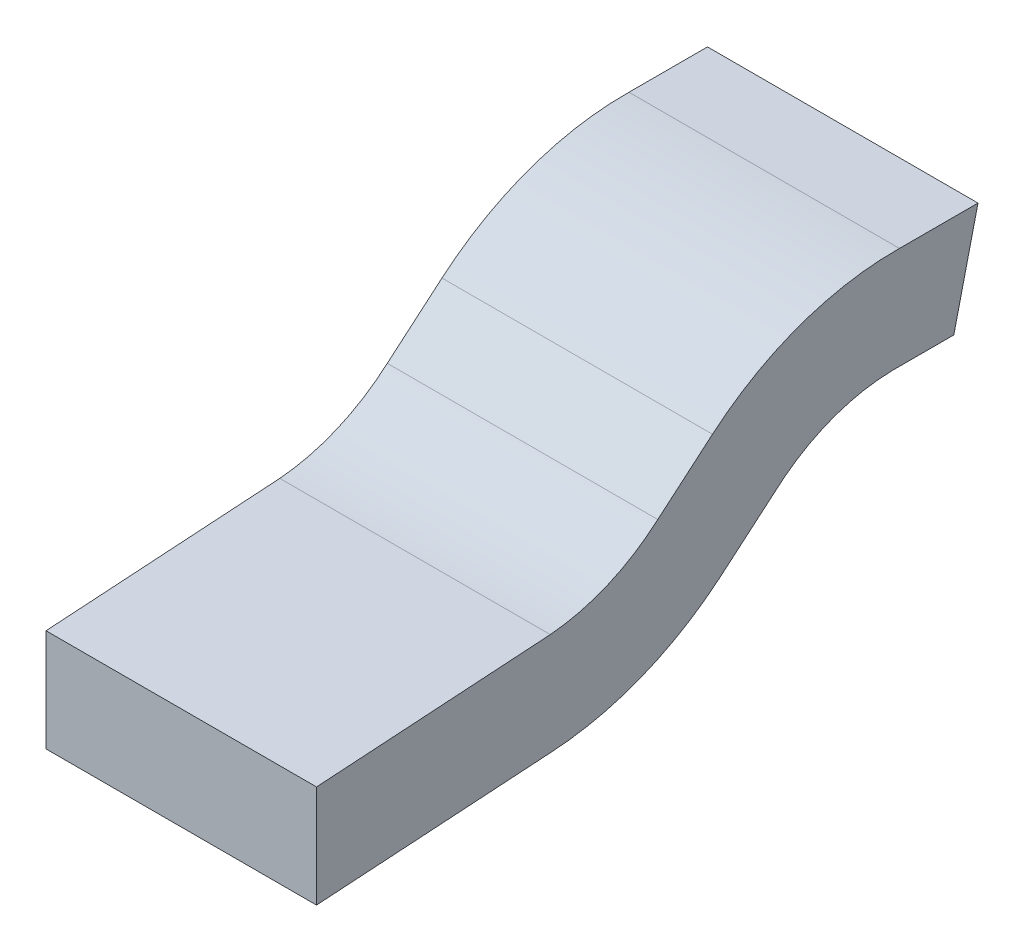
ISO-10303-21;
HEADER;
FILE_DESCRIPTION(('STEP AP214'),'2;1');
FILE_NAME('part.step','',(''),(''),'','','');
FILE_SCHEMA(('AUTOMOTIVE_DESIGN { 1 0 10303 214 1 1 1 1 }'));
ENDSEC;
DATA;
#1=APPLICATION_CONTEXT('core data for automotive mechanical design processes');
#2=APPLICATION_PROTOCOL_DEFINITION('international standard','automotive_design',2000,#1);
#3=PRODUCT_CONTEXT('',#1,'mechanical');
#4=PRODUCT('Part','Part','',(#3));
#5=PRODUCT_RELATED_PRODUCT_CATEGORY('part','',(#4));
#6=PRODUCT_DEFINITION_FORMATION('','',#4);
#7=PRODUCT_DEFINITION_CONTEXT('part definition',#1,'design');
#8=PRODUCT_DEFINITION('design','',#6,#7);
#9=PRODUCT_DEFINITION_SHAPE('','',#8);
#10=(LENGTH_UNIT() NAMED_UNIT(*) SI_UNIT(.MILLI.,.METRE.));
#11=(NAMED_UNIT(*) PLANE_ANGLE_UNIT() SI_UNIT($,.RADIAN.));
#12=(NAMED_UNIT(*) SI_UNIT($,.STERADIAN.) SOLID_ANGLE_UNIT());
#13=UNCERTAINTY_MEASURE_WITH_UNIT(LENGTH_MEASURE(1.E-05),#10,'distance_accuracy_value','');
#14=(GEOMETRIC_REPRESENTATION_CONTEXT(3) GLOBAL_UNCERTAINTY_ASSIGNED_CONTEXT((#13)) GLOBAL_UNIT_ASSIGNED_CONTEXT((#10,
#11,#12)) REPRESENTATION_CONTEXT('',''));
#15=CARTESIAN_POINT('',(0.,0.,0.));
#16=DIRECTION('',(0.,0.,1.));
#17=DIRECTION('',(1.,0.,0.));
#18=AXIS2_PLACEMENT_3D('',#15,#16,#17);
#19=CARTESIAN_POINT('',(1.93,-0.21911513416,1.58959157295));
#20=DIRECTION('',(-1.,0.,0.));
#21=DIRECTION('',(0.,1.,0.));
#22=AXIS2_PLACEMENT_3D('',#19,#20,#21);
#23=PLANE('',#22);
#24=CARTESIAN_POINT('',(1.93,-0.856134104349004,1.903958845955));
#25=DIRECTION('',(1.,0.,0.));
#26=DIRECTION('',(0.,0.936329177569152,0.351123441588105));
#27=AXIS2_PLACEMENT_3D('',#24,#25,#26);
#28=CIRCLE('',#27,0.776782196841003);
#29=CARTESIAN_POINT('',(1.93,-0.07940390005396,1.894971573585));
#30=VERTEX_POINT('',#29);
#31=CARTESIAN_POINT('',(1.93,-0.263875831851088,2.40649088251571));
#32=VERTEX_POINT('',#31);
#33=EDGE_CURVE('E317',#30,#32,#28,.T.);
#34=ORIENTED_EDGE('',*,*,#33,.F.);
#35=DIRECTION('',(0.,0.,1.));
#36=VECTOR('',#35,1.);
#37=CARTESIAN_POINT('',(1.93,-0.07940390005396,1.580604300581));
#38=LINE('',#37,#36);
#39=CARTESIAN_POINT('',(1.93,-0.07940390005397,1.680137635818));
#40=VERTEX_POINT('',#39);
#41=EDGE_CURVE('E29',#40,#30,#38,.T.);
#42=ORIENTED_EDGE('',*,*,#41,.F.);
#43=DIRECTION('',(0.,-0.973080287490057,0.230466383879013));
#44=VECTOR('',#43,1.);
#45=CARTESIAN_POINT('',(1.93,-0.630185003499,1.810585791897));
#46=LINE('',#45,#44);
#47=CARTESIAN_POINT('',(1.93,-0.358826368266,1.746316641447));
#48=VERTEX_POINT('',#47);
#49=EDGE_CURVE('E11',#40,#48,#46,.T.);
#50=ORIENTED_EDGE('',*,*,#49,.T.);
#51=DIRECTION('',(0.,0.,-1.));
#52=VECTOR('',#51,1.);
#53=CARTESIAN_POINT('',(1.93,-0.358826368266,1.59857884532));
#54=LINE('',#53,#52);
#55=CARTESIAN_POINT('',(1.93,-0.358826368266,1.912946118324));
#56=VERTEX_POINT('',#55);
#57=EDGE_CURVE('E353',#56,#48,#54,.T.);
#58=ORIENTED_EDGE('',*,*,#57,.F.);
#59=CARTESIAN_POINT('',(1.93,-0.856134104348996,1.903958845955));
#60=DIRECTION('',(1.,0.,0.));
#61=DIRECTION('',(0.,0.738961988180257,0.67374711875056));
#62=AXIS2_PLACEMENT_3D('',#59,#60,#61);
#63=CIRCLE('',#62,0.497388937787997);
#64=CARTESIAN_POINT('',(1.93,-0.488521483012,2.2391289202));
#65=VERTEX_POINT('',#64);
#66=EDGE_CURVE('E152',#56,#65,#63,.T.);
#67=ORIENTED_EDGE('',*,*,#66,.T.);
#68=DIRECTION('',(0.,0.647648420096034,-0.76193931775904));
#69=VECTOR('',#68,1.);
#70=CARTESIAN_POINT('',(1.93,-0.48846038004,2.239184630712));
#71=LINE('',#70,#69);
#72=CARTESIAN_POINT('',(1.93,-0.615614851585,2.388778126647));
#73=VERTEX_POINT('',#72);
#74=EDGE_CURVE('E146',#73,#65,#71,.T.);
#75=ORIENTED_EDGE('',*,*,#74,.F.);
#76=CARTESIAN_POINT('',(1.93,-0.00794982250667015,2.893498141348));
#77=DIRECTION('',(1.,0.,0.));
#78=DIRECTION('',(0.,-0.926566511782986,-0.376130960228364));
#79=AXIS2_PLACEMENT_3D('',#76,#77,#78);
#80=CIRCLE('',#79,0.789936124509003);
#81=CARTESIAN_POINT('',(1.93,-0.796685529020846,2.85013723881213));
#82=VERTEX_POINT('',#81);
#83=EDGE_CURVE('E336',#82,#73,#80,.T.);
#84=ORIENTED_EDGE('',*,*,#83,.F.);
#85=DIRECTION('',(0.,0.0641948026383885,-0.997937386469822));
#86=VECTOR('',#85,1.);
#87=CARTESIAN_POINT('',(1.93,-0.796676109769,2.850137707743));
#88=LINE('',#87,#86);
#89=CARTESIAN_POINT('',(1.93,-0.837814321152,3.489649902865));
#90=VERTEX_POINT('',#89);
#91=EDGE_CURVE('E367',#90,#82,#88,.T.);
#92=ORIENTED_EDGE('',*,*,#91,.F.);
#93=DIRECTION('',(0.,-1.,0.));
#94=VECTOR('',#93,1.);
#95=CARTESIAN_POINT('',(1.93,-0.697814321152,3.489649902865));
#96=LINE('',#95,#94);
#97=CARTESIAN_POINT('',(1.93,-0.557814321152,3.489649902865));
#98=VERTEX_POINT('',#97);
#99=EDGE_CURVE('E374',#98,#90,#96,.T.);
#100=ORIENTED_EDGE('',*,*,#99,.F.);
#101=DIRECTION('',(0.,-0.0641948026383885,0.997937386469822));
#102=VECTOR('',#101,1.);
#103=CARTESIAN_POINT('',(1.93,-0.516676109769,2.850137707743));
#104=LINE('',#103,#102);
#105=CARTESIAN_POINT('',(1.93,-0.516661571834,2.85013894686));
#106=VERTEX_POINT('',#105);
#107=EDGE_CURVE('E243',#106,#98,#104,.T.);
#108=ORIENTED_EDGE('',*,*,#107,.F.);
#109=CARTESIAN_POINT('',(1.93,-0.00794982250666897,2.89349814134801));
#110=DIRECTION('',(1.,0.,0.));
#111=DIRECTION('',(0.,-0.750420434887286,-0.660960793771898));
#112=AXIS2_PLACEMENT_3D('',#109,#110,#111);
#113=CIRCLE('',#112,0.510541639019009);
#114=CARTESIAN_POINT('',(1.93,-0.391070701287,2.556050134368));
#115=VERTEX_POINT('',#114);
#116=EDGE_CURVE('E246',#106,#115,#113,.T.);
#117=ORIENTED_EDGE('',*,*,#116,.T.);
#118=DIRECTION('',(0.,-0.647648420096034,0.76193931775904));
#119=VECTOR('',#118,1.);
#120=CARTESIAN_POINT('',(1.93,-0.263916229743,2.406456638433));
#121=LINE('',#120,#119);
#122=EDGE_CURVE('E318',#32,#115,#121,.T.);
#123=ORIENTED_EDGE('',*,*,#122,.F.);
#124=EDGE_LOOP('',(#34,#42,#50,#58,#67,#75,#84,#92,#100,#108,#117,#123));
#125=FACE_BOUND('',#124,.T.);
#126=ADVANCED_FACE('F17',(#125),#23,.T.);
#127=CARTESIAN_POINT('',(2.3,-0.630185003499,1.810585791897));
#128=DIRECTION('',(0.,0.230466383879013,0.973080287490057));
#129=DIRECTION('',(1.,4.09093995219019E-13,0.));
#130=AXIS2_PLACEMENT_3D('',#127,#128,#129);
#131=PLANE('',#130);
#132=DIRECTION('',(-1.,0.,0.));
#133=VECTOR('',#132,1.);
#134=CARTESIAN_POINT('',(2.3,-0.07940390005396,1.680137635818));
#135=LINE('',#134,#133);
#136=CARTESIAN_POINT('',(2.67,-0.07940390005396,1.680137635818));
#137=VERTEX_POINT('',#136);
#138=EDGE_CURVE('E340',#137,#40,#135,.T.);
#139=ORIENTED_EDGE('',*,*,#138,.F.);
#140=DIRECTION('',(0.,0.973080287490057,-0.230466383879013));
#141=VECTOR('',#140,1.);
#142=CARTESIAN_POINT('',(2.67,-0.358826368266,1.746316641447));
#143=LINE('',#142,#141);
#144=CARTESIAN_POINT('',(2.67,-0.358826368266,1.746316641447));
#145=VERTEX_POINT('',#144);
#146=EDGE_CURVE('E176',#145,#137,#143,.T.);
#147=ORIENTED_EDGE('',*,*,#146,.F.);
#148=DIRECTION('',(1.,0.,0.));
#149=VECTOR('',#148,1.);
#150=CARTESIAN_POINT('',(2.3,-0.358826368266,1.746316641447));
#151=LINE('',#150,#149);
#152=EDGE_CURVE('E186',#48,#145,#151,.T.);
#153=ORIENTED_EDGE('',*,*,#152,.F.);
#154=ORIENTED_EDGE('',*,*,#49,.F.);
#155=EDGE_LOOP('',(#139,#147,#153,#154));
#156=FACE_BOUND('',#155,.T.);
#157=ADVANCED_FACE('F19',(#156),#131,.F.);
#158=CARTESIAN_POINT('',(2.3,-0.07940390005396,1.580604300581));
#159=DIRECTION('',(0.,1.,0.));
#160=DIRECTION('',(1.,0.,0.));
#161=AXIS2_PLACEMENT_3D('',#158,#159,#160);
#162=PLANE('',#161);
#163=DIRECTION('',(-1.,0.,0.));
#164=VECTOR('',#163,1.);
#165=CARTESIAN_POINT('',(2.3,-0.07940390005396,1.894971573585));
#166=LINE('',#165,#164);
#167=CARTESIAN_POINT('',(2.67,-0.07940390005396,1.894971573585));
#168=VERTEX_POINT('',#167);
#169=EDGE_CURVE('E311',#168,#30,#166,.T.);
#170=ORIENTED_EDGE('',*,*,#169,.F.);
#171=DIRECTION('',(0.,0.,1.));
#172=VECTOR('',#171,1.);
#173=CARTESIAN_POINT('',(2.67,-0.07940390005396,1.58959157295));
#174=LINE('',#173,#172);
#175=EDGE_CURVE('E314',#137,#168,#174,.T.);
#176=ORIENTED_EDGE('',*,*,#175,.F.);
#177=ORIENTED_EDGE('',*,*,#138,.T.);
#178=ORIENTED_EDGE('',*,*,#41,.T.);
#179=EDGE_LOOP('',(#170,#176,#177,#178));
#180=FACE_BOUND('',#179,.T.);
#181=ADVANCED_FACE('F267',(#180),#162,.T.);
#182=CARTESIAN_POINT('',(2.3,-0.856134104349,1.903958845955));
#183=DIRECTION('',(-1.,0.,0.));
#184=DIRECTION('',(0.,0.,1.));
#185=AXIS2_PLACEMENT_3D('',#182,#183,#184);
#186=CYLINDRICAL_SURFACE('',#185,0.776782196841);
#187=CARTESIAN_POINT('',(2.67,-0.263916199883721,2.40645660330444));
#188=DIRECTION('',(-1.,0.,0.));
#189=VECTOR('',#188,1.);
#190=LINE('',#187,#189);
#191=CARTESIAN_POINT('',(2.67,-0.263875831851088,2.40649088251571));
#192=VERTEX_POINT('',#191);
#193=EDGE_CURVE('E323',#192,#32,#190,.T.);
#194=ORIENTED_EDGE('',*,*,#193,.F.);
#195=CARTESIAN_POINT('',(2.67,-0.856134104349,1.903958845955));
#196=DIRECTION('',(1.,0.,0.));
#197=DIRECTION('',(0.,0.,1.));
#198=AXIS2_PLACEMENT_3D('',#195,#196,#197);
#199=CIRCLE('',#198,0.776782196841);
#200=EDGE_CURVE('E321',#168,#192,#199,.T.);
#201=ORIENTED_EDGE('',*,*,#200,.F.);
#202=ORIENTED_EDGE('',*,*,#169,.T.);
#203=ORIENTED_EDGE('',*,*,#33,.T.);
#204=EDGE_LOOP('',(#194,#201,#202,#203));
#205=FACE_BOUND('',#204,.T.);
#206=ADVANCED_FACE('F258',(#205),#186,.T.);
#207=CARTESIAN_POINT('',(2.3,-0.263916229743,2.406456638433));
#208=DIRECTION('',(0.,0.76193931775904,0.647648420096034));
#209=DIRECTION('',(1.,0.,0.));
#210=AXIS2_PLACEMENT_3D('',#207,#208,#209);
#211=PLANE('',#210);
#212=ORIENTED_EDGE('',*,*,#193,.T.);
#213=ORIENTED_EDGE('',*,*,#122,.T.);
#214=DIRECTION('',(1.,0.,0.));
#215=VECTOR('',#214,1.);
#216=CARTESIAN_POINT('',(2.3,-0.391070701287,2.556050134368));
#217=LINE('',#216,#215);
#218=CARTESIAN_POINT('',(2.67,-0.391070701287,2.556050134368));
#219=VERTEX_POINT('',#218);
#220=EDGE_CURVE('E252',#115,#219,#217,.T.);
#221=ORIENTED_EDGE('',*,*,#220,.T.);
#222=DIRECTION('',(0.,-0.647648420096034,0.76193931775904));
#223=VECTOR('',#222,1.);
#224=CARTESIAN_POINT('',(2.67,-0.263916229743,2.406456638433));
#225=LINE('',#224,#223);
#226=EDGE_CURVE('E234',#192,#219,#225,.T.);
#227=ORIENTED_EDGE('',*,*,#226,.F.);
#228=EDGE_LOOP('',(#212,#213,#221,#227));
#229=FACE_BOUND('',#228,.T.);
#230=ADVANCED_FACE('F206',(#229),#211,.T.);
#231=CARTESIAN_POINT('',(2.3,-0.007949822506674,2.893498141348));
#232=DIRECTION('',(1.,0.,0.));
#233=DIRECTION('',(0.,0.,-1.));
#234=AXIS2_PLACEMENT_3D('',#231,#232,#233);
#235=CYLINDRICAL_SURFACE('',#234,0.510541639019);
#236=ORIENTED_EDGE('',*,*,#116,.F.);
#237=CARTESIAN_POINT('',(2.67,-0.516676129239368,2.85013801041872));
#238=DIRECTION('',(-1.,0.,0.));
#239=VECTOR('',#238,1.);
#240=LINE('',#237,#239);
#241=CARTESIAN_POINT('',(2.67,-0.516661720904141,2.85014096168472));
#242=VERTEX_POINT('',#241);
#243=EDGE_CURVE('E226',#242,#106,#240,.T.);
#244=ORIENTED_EDGE('',*,*,#243,.F.);
#245=CARTESIAN_POINT('',(2.67,-0.007949822506674,2.893498141348));
#246=DIRECTION('',(-1.,0.,0.));
#247=DIRECTION('',(0.,0.,-1.));
#248=AXIS2_PLACEMENT_3D('',#245,#246,#247);
#249=CIRCLE('',#248,0.510541639019);
#250=EDGE_CURVE('E229',#219,#242,#249,.T.);
#251=ORIENTED_EDGE('',*,*,#250,.F.);
#252=ORIENTED_EDGE('',*,*,#220,.F.);
#253=EDGE_LOOP('',(#236,#244,#251,#252));
#254=FACE_BOUND('',#253,.T.);
#255=ADVANCED_FACE('F196',(#254),#235,.F.);
#256=CARTESIAN_POINT('',(2.3,-0.516676109769,2.850137707743));
#257=DIRECTION('',(0.,0.997937386469822,0.0641948026383885));
#258=DIRECTION('',(1.,0.,0.));
#259=AXIS2_PLACEMENT_3D('',#256,#257,#258);
#260=PLANE('',#259);
#261=ORIENTED_EDGE('',*,*,#243,.T.);
#262=ORIENTED_EDGE('',*,*,#107,.T.);
#263=DIRECTION('',(-1.,0.,0.));
#264=VECTOR('',#263,1.);
#265=CARTESIAN_POINT('',(2.3,-0.557814321152,3.489649902865));
#266=LINE('',#265,#264);
#267=CARTESIAN_POINT('',(2.67,-0.557814321152,3.489649902865));
#268=VERTEX_POINT('',#267);
#269=EDGE_CURVE('E370',#268,#98,#266,.T.);
#270=ORIENTED_EDGE('',*,*,#269,.F.);
#271=DIRECTION('',(0.,-0.0641948026383786,0.997937386469822));
#272=VECTOR('',#271,1.);
#273=CARTESIAN_POINT('',(2.67,-0.516676109769,2.850137707743));
#274=LINE('',#273,#272);
#275=EDGE_CURVE('E233',#242,#268,#274,.T.);
#276=ORIENTED_EDGE('',*,*,#275,.F.);
#277=EDGE_LOOP('',(#261,#262,#270,#276));
#278=FACE_BOUND('',#277,.T.);
#279=ADVANCED_FACE('F205',(#278),#260,.T.);
#280=CARTESIAN_POINT('',(2.3,-0.697814321152,3.489649902865));
#281=DIRECTION('',(0.,0.,1.));
#282=DIRECTION('',(0.,-1.,0.));
#283=AXIS2_PLACEMENT_3D('',#280,#281,#282);
#284=PLANE('',#283);
#285=DIRECTION('',(0.,-1.,0.));
#286=VECTOR('',#285,1.);
#287=CARTESIAN_POINT('',(2.67,-0.21911513416,3.489649902865));
#288=LINE('',#287,#286);
#289=CARTESIAN_POINT('',(2.67,-0.837814321152,3.489649902865));
#290=VERTEX_POINT('',#289);
#291=EDGE_CURVE('E240',#268,#290,#288,.T.);
#292=ORIENTED_EDGE('',*,*,#291,.F.);
#293=ORIENTED_EDGE('',*,*,#269,.T.);
#294=ORIENTED_EDGE('',*,*,#99,.T.);
#295=DIRECTION('',(-1.,0.,0.));
#296=VECTOR('',#295,1.);
#297=CARTESIAN_POINT('',(2.3,-0.837814321152,3.489649902865));
#298=LINE('',#297,#296);
#299=EDGE_CURVE('E339',#290,#90,#298,.T.);
#300=ORIENTED_EDGE('',*,*,#299,.F.);
#301=EDGE_LOOP('',(#292,#293,#294,#300));
#302=FACE_BOUND('',#301,.T.);
#303=ADVANCED_FACE('F211',(#302),#284,.T.);
#304=CARTESIAN_POINT('',(2.3,-0.796676109769,2.850137707743));
#305=DIRECTION('',(0.,-0.997937386469822,-0.0641948026383885));
#306=DIRECTION('',(0.,0.0641948026383885,-0.997937386469822));
#307=AXIS2_PLACEMENT_3D('',#304,#305,#306);
#308=PLANE('',#307);
#309=DIRECTION('',(-1.,0.,0.));
#310=VECTOR('',#309,1.);
#311=CARTESIAN_POINT('',(2.67,-0.796685525978,2.850137190085));
#312=LINE('',#311,#310);
#313=CARTESIAN_POINT('',(2.67,-0.796685529021146,2.85013723881211));
#314=VERTEX_POINT('',#313);
#315=EDGE_CURVE('E191',#314,#82,#312,.T.);
#316=ORIENTED_EDGE('',*,*,#315,.F.);
#317=DIRECTION('',(0.,0.0641948026383786,-0.997937386469822));
#318=VECTOR('',#317,1.);
#319=CARTESIAN_POINT('',(2.67,-0.837814321152,3.489649902865));
#320=LINE('',#319,#318);
#321=EDGE_CURVE('E343',#290,#314,#320,.T.);
#322=ORIENTED_EDGE('',*,*,#321,.F.);
#323=ORIENTED_EDGE('',*,*,#299,.T.);
#324=ORIENTED_EDGE('',*,*,#91,.T.);
#325=EDGE_LOOP('',(#316,#322,#323,#324));
#326=FACE_BOUND('',#325,.T.);
#327=ADVANCED_FACE('F269',(#326),#308,.T.);
#328=CARTESIAN_POINT('',(2.3,-0.007949822506674,2.893498141348));
#329=DIRECTION('',(1.,0.,0.));
#330=DIRECTION('',(0.,0.,-1.));
#331=AXIS2_PLACEMENT_3D('',#328,#329,#330);
#332=CYLINDRICAL_SURFACE('',#331,0.789936124509);
#333=DIRECTION('',(-1.,0.,0.));
#334=VECTOR('',#333,1.);
#335=CARTESIAN_POINT('',(2.3,-0.615614851585,2.388778126647));
#336=LINE('',#335,#334);
#337=CARTESIAN_POINT('',(2.67,-0.615614851585,2.388778126647));
#338=VERTEX_POINT('',#337);
#339=EDGE_CURVE('E151',#338,#73,#336,.T.);
#340=ORIENTED_EDGE('',*,*,#339,.F.);
#341=CARTESIAN_POINT('',(2.67,-0.007949822506674,2.893498141348));
#342=DIRECTION('',(1.,0.,0.));
#343=DIRECTION('',(0.,0.,-1.));
#344=AXIS2_PLACEMENT_3D('',#341,#342,#343);
#345=CIRCLE('',#344,0.789936124509);
#346=EDGE_CURVE('E162',#314,#338,#345,.T.);
#347=ORIENTED_EDGE('',*,*,#346,.F.);
#348=ORIENTED_EDGE('',*,*,#315,.T.);
#349=ORIENTED_EDGE('',*,*,#83,.T.);
#350=EDGE_LOOP('',(#340,#347,#348,#349));
#351=FACE_BOUND('',#350,.T.);
#352=ADVANCED_FACE('F277',(#351),#332,.T.);
#353=CARTESIAN_POINT('',(2.3,-0.48846038004,2.239184630712));
#354=DIRECTION('',(0.,-0.76193931775904,-0.647648420096034));
#355=DIRECTION('',(0.,0.647648420096034,-0.76193931775904));
#356=AXIS2_PLACEMENT_3D('',#353,#354,#355);
#357=PLANE('',#356);
#358=CARTESIAN_POINT('',(1.93,-0.488458518189243,2.23918244029934));
#359=DIRECTION('',(1.,0.,0.));
#360=VECTOR('',#359,1.);
#361=LINE('',#358,#360);
#362=CARTESIAN_POINT('',(2.67,-0.488521483012,2.2391289202));
#363=VERTEX_POINT('',#362);
#364=EDGE_CURVE('E138',#65,#363,#361,.T.);
#365=ORIENTED_EDGE('',*,*,#364,.T.);
#366=DIRECTION('',(0.,0.647648420096034,-0.76193931775904));
#367=VECTOR('',#366,1.);
#368=CARTESIAN_POINT('',(2.67,-0.615614851585,2.388778126647));
#369=LINE('',#368,#367);
#370=EDGE_CURVE('E143',#338,#363,#369,.T.);
#371=ORIENTED_EDGE('',*,*,#370,.F.);
#372=ORIENTED_EDGE('',*,*,#339,.T.);
#373=ORIENTED_EDGE('',*,*,#74,.T.);
#374=EDGE_LOOP('',(#365,#371,#372,#373));
#375=FACE_BOUND('',#374,.T.);
#376=ADVANCED_FACE('F141',(#375),#357,.T.);
#377=CARTESIAN_POINT('',(2.3,-0.856134104349,1.903958845955));
#378=DIRECTION('',(-1.,0.,0.));
#379=DIRECTION('',(0.,0.,1.));
#380=AXIS2_PLACEMENT_3D('',#377,#378,#379);
#381=CYLINDRICAL_SURFACE('',#380,0.497388937788);
#382=ORIENTED_EDGE('',*,*,#66,.F.);
#383=DIRECTION('',(-1.,0.,0.));
#384=VECTOR('',#383,1.);
#385=CARTESIAN_POINT('',(2.3,-0.358826368266,1.912946118324));
#386=LINE('',#385,#384);
#387=CARTESIAN_POINT('',(2.67,-0.358826368266,1.912946118324));
#388=VERTEX_POINT('',#387);
#389=EDGE_CURVE('E164',#388,#56,#386,.T.);
#390=ORIENTED_EDGE('',*,*,#389,.F.);
#391=CARTESIAN_POINT('',(2.67,-0.856134104349,1.903958845955));
#392=DIRECTION('',(-1.,0.,0.));
#393=DIRECTION('',(0.,0.,1.));
#394=AXIS2_PLACEMENT_3D('',#391,#392,#393);
#395=CIRCLE('',#394,0.497388937788);
#396=EDGE_CURVE('E159',#363,#388,#395,.T.);
#397=ORIENTED_EDGE('',*,*,#396,.F.);
#398=ORIENTED_EDGE('',*,*,#364,.F.);
#399=EDGE_LOOP('',(#382,#390,#397,#398));
#400=FACE_BOUND('',#399,.T.);
#401=ADVANCED_FACE('F166',(#400),#381,.F.);
#402=CARTESIAN_POINT('',(2.3,-0.358826368266,1.59857884532));
#403=DIRECTION('',(0.,-1.,0.));
#404=DIRECTION('',(0.,0.,-1.));
#405=AXIS2_PLACEMENT_3D('',#402,#403,#404);
#406=PLANE('',#405);
#407=ORIENTED_EDGE('',*,*,#389,.T.);
#408=ORIENTED_EDGE('',*,*,#57,.T.);
#409=ORIENTED_EDGE('',*,*,#152,.T.);
#410=DIRECTION('',(0.,0.,-1.));
#411=VECTOR('',#410,1.);
#412=CARTESIAN_POINT('',(2.67,-0.358826368266,1.58959157295));
#413=LINE('',#412,#411);
#414=EDGE_CURVE('E170',#388,#145,#413,.T.);
#415=ORIENTED_EDGE('',*,*,#414,.F.);
#416=EDGE_LOOP('',(#407,#408,#409,#415));
#417=FACE_BOUND('',#416,.T.);
#418=ADVANCED_FACE('F288',(#417),#406,.T.);
#419=CARTESIAN_POINT('',(2.67,-0.21911513416,1.58959157295));
#420=DIRECTION('',(1.,0.,0.));
#421=DIRECTION('',(0.,1.,0.));
#422=AXIS2_PLACEMENT_3D('',#419,#420,#421);
#423=PLANE('',#422);
#424=ORIENTED_EDGE('',*,*,#396,.T.);
#425=ORIENTED_EDGE('',*,*,#414,.T.);
#426=ORIENTED_EDGE('',*,*,#146,.T.);
#427=ORIENTED_EDGE('',*,*,#175,.T.);
#428=ORIENTED_EDGE('',*,*,#200,.T.);
#429=ORIENTED_EDGE('',*,*,#226,.T.);
#430=ORIENTED_EDGE('',*,*,#250,.T.);
#431=ORIENTED_EDGE('',*,*,#275,.T.);
#432=ORIENTED_EDGE('',*,*,#291,.T.);
#433=ORIENTED_EDGE('',*,*,#321,.T.);
#434=ORIENTED_EDGE('',*,*,#346,.T.);
#435=ORIENTED_EDGE('',*,*,#370,.T.);
#436=EDGE_LOOP('',(#424,#425,#426,#427,#428,#429,#430,#431,#432,#433,#434,#435));
#437=FACE_BOUND('',#436,.T.);
#438=ADVANCED_FACE('F157',(#437),#423,.T.);
#439=CLOSED_SHELL('',(#126,#157,#181,#206,#230,#255,#279,#303,#327,#352,#376,#401,#418,#438));
#440=MANIFOLD_SOLID_BREP('B1',#439);
#441=ADVANCED_BREP_SHAPE_REPRESENTATION('',(#18,#440),#14);
#442=SHAPE_DEFINITION_REPRESENTATION(#9,#441);
ENDSEC;
END-ISO-10303-21;
